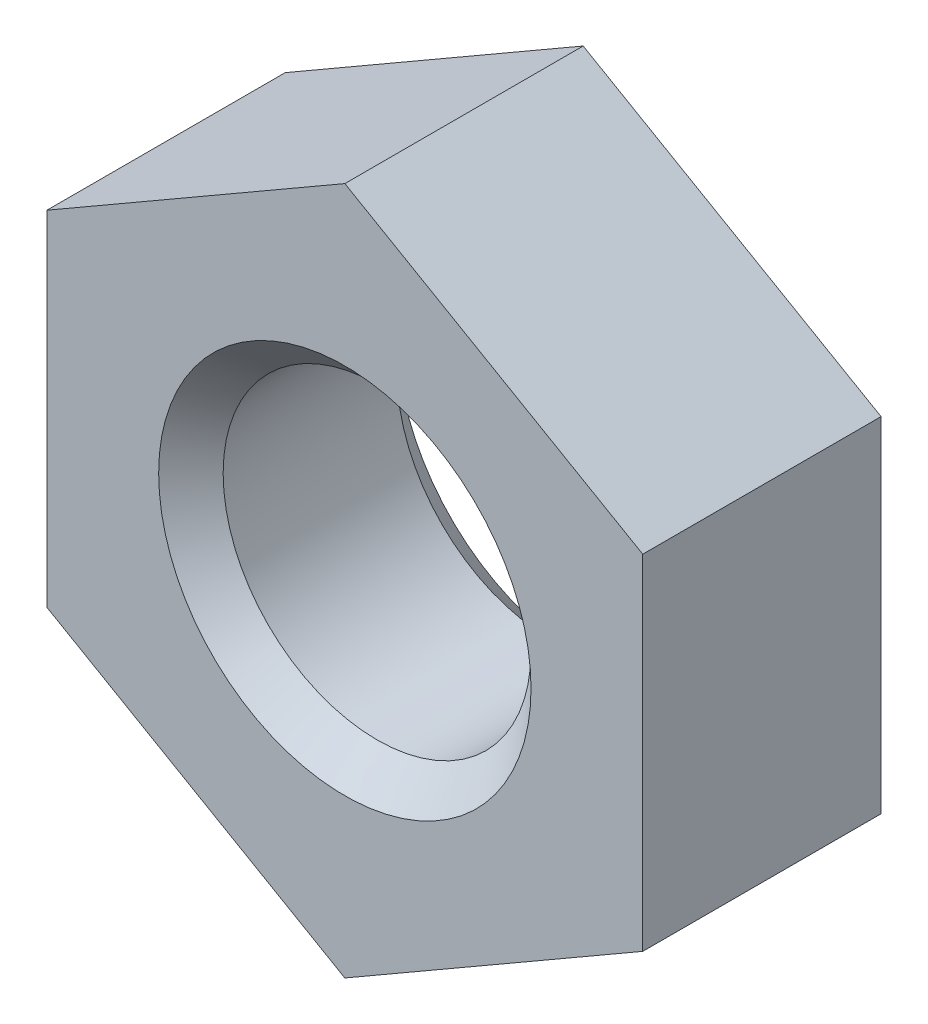
ISO-10303-21;
HEADER;
FILE_DESCRIPTION(('STEP AP214'),'2;1');
FILE_NAME('part.step','',(''),(''),'','','');
FILE_SCHEMA(('AUTOMOTIVE_DESIGN { 1 0 10303 214 1 1 1 1 }'));
ENDSEC;
DATA;
#1=APPLICATION_CONTEXT('core data for automotive mechanical design processes');
#2=APPLICATION_PROTOCOL_DEFINITION('international standard','automotive_design',2000,#1);
#3=PRODUCT_CONTEXT('',#1,'mechanical');
#4=PRODUCT('Part','Part','',(#3));
#5=PRODUCT_RELATED_PRODUCT_CATEGORY('part','',(#4));
#6=PRODUCT_DEFINITION_FORMATION('','',#4);
#7=PRODUCT_DEFINITION_CONTEXT('part definition',#1,'design');
#8=PRODUCT_DEFINITION('design','',#6,#7);
#9=PRODUCT_DEFINITION_SHAPE('','',#8);
#10=(LENGTH_UNIT() NAMED_UNIT(*) SI_UNIT(.MILLI.,.METRE.));
#11=(NAMED_UNIT(*) PLANE_ANGLE_UNIT() SI_UNIT($,.RADIAN.));
#12=(NAMED_UNIT(*) SI_UNIT($,.STERADIAN.) SOLID_ANGLE_UNIT());
#13=UNCERTAINTY_MEASURE_WITH_UNIT(LENGTH_MEASURE(1.E-05),#10,'distance_accuracy_value','');
#14=(GEOMETRIC_REPRESENTATION_CONTEXT(3) GLOBAL_UNCERTAINTY_ASSIGNED_CONTEXT((#13)) GLOBAL_UNIT_ASSIGNED_CONTEXT((#10,
#11,#12)) REPRESENTATION_CONTEXT('',''));
#15=CARTESIAN_POINT('',(0.,0.,0.));
#16=DIRECTION('',(0.,0.,1.));
#17=DIRECTION('',(1.,0.,0.));
#18=AXIS2_PLACEMENT_3D('',#15,#16,#17);
#19=CARTESIAN_POINT('',(-4.,-2.3094010767585,3.2));
#20=DIRECTION('',(-1.,0.,0.));
#21=DIRECTION('',(0.,1.,0.));
#22=AXIS2_PLACEMENT_3D('',#19,#20,#21);
#23=PLANE('',#22);
#24=DIRECTION('',(0.,-1.,0.));
#25=VECTOR('',#24,1.);
#26=CARTESIAN_POINT('',(-4.,2.3094010767585,0.));
#27=LINE('',#26,#25);
#28=CARTESIAN_POINT('',(-4.,2.3094010767585,0.));
#29=VERTEX_POINT('',#28);
#30=CARTESIAN_POINT('',(-4.,-2.3094010767585,0.));
#31=VERTEX_POINT('',#30);
#32=EDGE_CURVE('E72',#29,#31,#27,.T.);
#33=ORIENTED_EDGE('',*,*,#32,.T.);
#34=DIRECTION('',(0.,0.,1.));
#35=VECTOR('',#34,1.);
#36=CARTESIAN_POINT('',(-4.,-2.3094010767585,0.));
#37=LINE('',#36,#35);
#38=CARTESIAN_POINT('',(-4.,-2.3094010767585,3.2));
#39=VERTEX_POINT('',#38);
#40=EDGE_CURVE('E86',#39,#31,#37,.F.);
#41=ORIENTED_EDGE('',*,*,#40,.F.);
#42=DIRECTION('',(0.,1.,0.));
#43=VECTOR('',#42,1.);
#44=CARTESIAN_POINT('',(-4.,-2.3094010767585,3.2));
#45=LINE('',#44,#43);
#46=CARTESIAN_POINT('',(-4.,2.3094010767585,3.2));
#47=VERTEX_POINT('',#46);
#48=EDGE_CURVE('E92',#47,#39,#45,.F.);
#49=ORIENTED_EDGE('',*,*,#48,.F.);
#50=DIRECTION('',(0.,0.,-1.));
#51=VECTOR('',#50,1.);
#52=CARTESIAN_POINT('',(-4.,2.3094010767585,3.2));
#53=LINE('',#52,#51);
#54=EDGE_CURVE('E80',#47,#29,#53,.T.);
#55=ORIENTED_EDGE('',*,*,#54,.T.);
#56=EDGE_LOOP('',(#33,#41,#49,#55));
#57=FACE_BOUND('',#56,.T.);
#58=ADVANCED_FACE('F17',(#57),#23,.T.);
#59=CARTESIAN_POINT('',(0.,-4.618802153517,0.));
#60=DIRECTION('',(-0.5,-0.866025403784439,0.));
#61=DIRECTION('',(0.,0.,1.));
#62=AXIS2_PLACEMENT_3D('',#59,#60,#61);
#63=PLANE('',#62);
#64=DIRECTION('',(0.866025403784439,-0.5,0.));
#65=VECTOR('',#64,1.);
#66=CARTESIAN_POINT('',(-4.,-2.3094010767585,0.));
#67=LINE('',#66,#65);
#68=CARTESIAN_POINT('',(0.,-4.618802153517,0.));
#69=VERTEX_POINT('',#68);
#70=EDGE_CURVE('E68',#31,#69,#67,.T.);
#71=ORIENTED_EDGE('',*,*,#70,.T.);
#72=DIRECTION('',(0.,0.,1.));
#73=VECTOR('',#72,1.);
#74=CARTESIAN_POINT('',(0.,-4.618802153517,0.));
#75=LINE('',#74,#73);
#76=CARTESIAN_POINT('',(0.,-4.618802153517,3.2));
#77=VERTEX_POINT('',#76);
#78=EDGE_CURVE('E79',#77,#69,#75,.F.);
#79=ORIENTED_EDGE('',*,*,#78,.F.);
#80=DIRECTION('',(-0.866025403784439,0.5,0.));
#81=VECTOR('',#80,1.);
#82=CARTESIAN_POINT('',(0.,-4.618802153517,3.2));
#83=LINE('',#82,#81);
#84=EDGE_CURVE('E91',#39,#77,#83,.F.);
#85=ORIENTED_EDGE('',*,*,#84,.F.);
#86=ORIENTED_EDGE('',*,*,#40,.T.);
#87=EDGE_LOOP('',(#71,#79,#85,#86));
#88=FACE_BOUND('',#87,.T.);
#89=ADVANCED_FACE('F90',(#88),#63,.T.);
#90=CARTESIAN_POINT('',(4.,-2.3094010767585,0.));
#91=DIRECTION('',(0.5,-0.866025403784439,0.));
#92=DIRECTION('',(0.,0.,1.));
#93=AXIS2_PLACEMENT_3D('',#90,#91,#92);
#94=PLANE('',#93);
#95=DIRECTION('',(0.866025403784439,0.5,0.));
#96=VECTOR('',#95,1.);
#97=CARTESIAN_POINT('',(0.,-4.618802153517,0.));
#98=LINE('',#97,#96);
#99=CARTESIAN_POINT('',(4.,-2.3094010767585,0.));
#100=VERTEX_POINT('',#99);
#101=EDGE_CURVE('E74',#69,#100,#98,.T.);
#102=ORIENTED_EDGE('',*,*,#101,.T.);
#103=DIRECTION('',(0.,0.,1.));
#104=VECTOR('',#103,1.);
#105=CARTESIAN_POINT('',(4.,-2.3094010767585,0.));
#106=LINE('',#105,#104);
#107=CARTESIAN_POINT('',(4.,-2.3094010767585,3.2));
#108=VERTEX_POINT('',#107);
#109=EDGE_CURVE('E114',#108,#100,#106,.F.);
#110=ORIENTED_EDGE('',*,*,#109,.F.);
#111=DIRECTION('',(-0.866025403784439,-0.5,0.));
#112=VECTOR('',#111,1.);
#113=CARTESIAN_POINT('',(4.,-2.3094010767585,3.2));
#114=LINE('',#113,#112);
#115=EDGE_CURVE('E119',#77,#108,#114,.F.);
#116=ORIENTED_EDGE('',*,*,#115,.F.);
#117=ORIENTED_EDGE('',*,*,#78,.T.);
#118=EDGE_LOOP('',(#102,#110,#116,#117));
#119=FACE_BOUND('',#118,.T.);
#120=ADVANCED_FACE('F184',(#119),#94,.T.);
#121=CARTESIAN_POINT('',(4.,-2.3094010767585,0.));
#122=DIRECTION('',(1.,0.,0.));
#123=DIRECTION('',(0.,1.,0.));
#124=AXIS2_PLACEMENT_3D('',#121,#122,#123);
#125=PLANE('',#124);
#126=DIRECTION('',(0.,1.,0.));
#127=VECTOR('',#126,1.);
#128=CARTESIAN_POINT('',(4.,-2.3094010767585,0.));
#129=LINE('',#128,#127);
#130=CARTESIAN_POINT('',(4.,2.3094010767585,0.));
#131=VERTEX_POINT('',#130);
#132=EDGE_CURVE('E123',#100,#131,#129,.T.);
#133=ORIENTED_EDGE('',*,*,#132,.T.);
#134=DIRECTION('',(0.,0.,1.));
#135=VECTOR('',#134,1.);
#136=CARTESIAN_POINT('',(4.,2.3094010767585,0.));
#137=LINE('',#136,#135);
#138=CARTESIAN_POINT('',(4.,2.3094010767585,3.2));
#139=VERTEX_POINT('',#138);
#140=EDGE_CURVE('E128',#139,#131,#137,.F.);
#141=ORIENTED_EDGE('',*,*,#140,.F.);
#142=DIRECTION('',(0.,-1.,0.));
#143=VECTOR('',#142,1.);
#144=CARTESIAN_POINT('',(4.,2.3094010767585,3.2));
#145=LINE('',#144,#143);
#146=EDGE_CURVE('E133',#108,#139,#145,.F.);
#147=ORIENTED_EDGE('',*,*,#146,.F.);
#148=ORIENTED_EDGE('',*,*,#109,.T.);
#149=EDGE_LOOP('',(#133,#141,#147,#148));
#150=FACE_BOUND('',#149,.T.);
#151=ADVANCED_FACE('F189',(#150),#125,.T.);
#152=CARTESIAN_POINT('',(0.,4.618802153517,0.));
#153=DIRECTION('',(0.5,0.866025403784439,0.));
#154=DIRECTION('',(0.,0.,1.));
#155=AXIS2_PLACEMENT_3D('',#152,#153,#154);
#156=PLANE('',#155);
#157=DIRECTION('',(-0.866025403784439,0.5,0.));
#158=VECTOR('',#157,1.);
#159=CARTESIAN_POINT('',(4.,2.3094010767585,0.));
#160=LINE('',#159,#158);
#161=CARTESIAN_POINT('',(0.,4.618802153517,0.));
#162=VERTEX_POINT('',#161);
#163=EDGE_CURVE('E137',#131,#162,#160,.T.);
#164=ORIENTED_EDGE('',*,*,#163,.T.);
#165=DIRECTION('',(0.,0.,1.));
#166=VECTOR('',#165,1.);
#167=CARTESIAN_POINT('',(0.,4.618802153517,0.));
#168=LINE('',#167,#166);
#169=CARTESIAN_POINT('',(0.,4.618802153517,3.2));
#170=VERTEX_POINT('',#169);
#171=EDGE_CURVE('E141',#170,#162,#168,.F.);
#172=ORIENTED_EDGE('',*,*,#171,.F.);
#173=DIRECTION('',(0.866025403784439,-0.5,0.));
#174=VECTOR('',#173,1.);
#175=CARTESIAN_POINT('',(0.,4.618802153517,3.2));
#176=LINE('',#175,#174);
#177=EDGE_CURVE('E32',#139,#170,#176,.F.);
#178=ORIENTED_EDGE('',*,*,#177,.F.);
#179=ORIENTED_EDGE('',*,*,#140,.T.);
#180=EDGE_LOOP('',(#164,#172,#178,#179));
#181=FACE_BOUND('',#180,.T.);
#182=ADVANCED_FACE('F193',(#181),#156,.T.);
#183=CARTESIAN_POINT('',(-4.,2.3094010767585,0.));
#184=DIRECTION('',(-0.5,0.866025403784439,0.));
#185=DIRECTION('',(0.,0.,1.));
#186=AXIS2_PLACEMENT_3D('',#183,#184,#185);
#187=PLANE('',#186);
#188=DIRECTION('',(-0.866025403784439,-0.5,0.));
#189=VECTOR('',#188,1.);
#190=CARTESIAN_POINT('',(0.,4.618802153517,0.));
#191=LINE('',#190,#189);
#192=EDGE_CURVE('E40',#162,#29,#191,.T.);
#193=ORIENTED_EDGE('',*,*,#192,.T.);
#194=ORIENTED_EDGE('',*,*,#54,.F.);
#195=DIRECTION('',(0.866025403784439,0.5,0.));
#196=VECTOR('',#195,1.);
#197=CARTESIAN_POINT('',(-4.,2.3094010767585,3.2));
#198=LINE('',#197,#196);
#199=EDGE_CURVE('E152',#170,#47,#198,.F.);
#200=ORIENTED_EDGE('',*,*,#199,.F.);
#201=ORIENTED_EDGE('',*,*,#171,.T.);
#202=EDGE_LOOP('',(#193,#194,#200,#201));
#203=FACE_BOUND('',#202,.T.);
#204=ADVANCED_FACE('F197',(#203),#187,.T.);
#205=CARTESIAN_POINT('',(-4.,-4.618802153517,3.2));
#206=DIRECTION('',(0.,0.,1.));
#207=DIRECTION('',(1.,0.,0.));
#208=AXIS2_PLACEMENT_3D('',#205,#206,#207);
#209=PLANE('',#208);
#210=ORIENTED_EDGE('',*,*,#48,.T.);
#211=ORIENTED_EDGE('',*,*,#84,.T.);
#212=ORIENTED_EDGE('',*,*,#115,.T.);
#213=ORIENTED_EDGE('',*,*,#146,.T.);
#214=ORIENTED_EDGE('',*,*,#177,.T.);
#215=ORIENTED_EDGE('',*,*,#199,.T.);
#216=EDGE_LOOP('',(#210,#211,#212,#213,#214,#215));
#217=FACE_BOUND('',#216,.T.);
#218=CARTESIAN_POINT('',(0.,0.,3.2));
#219=DIRECTION('',(0.,0.,-1.));
#220=DIRECTION('',(0.99999999999999,-1.42053902152387E-07,0.));
#221=AXIS2_PLACEMENT_3D('',#218,#219,#220);
#222=CIRCLE('',#221,2.5);
#223=CARTESIAN_POINT('',(2.49999999999997,-3.55134755380967E-07,3.2));
#224=VERTEX_POINT('',#223);
#225=EDGE_CURVE('E156',#224,#224,#222,.T.);
#226=ORIENTED_EDGE('',*,*,#225,.T.);
#227=EDGE_LOOP('',(#226));
#228=FACE_BOUND('',#227,.T.);
#229=ADVANCED_FACE('F201',(#217,#228),#209,.T.);
#230=CARTESIAN_POINT('',(-4.,-4.618802153517,0.));
#231=DIRECTION('',(0.,0.,-1.));
#232=DIRECTION('',(0.,1.,0.));
#233=AXIS2_PLACEMENT_3D('',#230,#231,#232);
#234=PLANE('',#233);
#235=ORIENTED_EDGE('',*,*,#32,.F.);
#236=ORIENTED_EDGE('',*,*,#192,.F.);
#237=ORIENTED_EDGE('',*,*,#163,.F.);
#238=ORIENTED_EDGE('',*,*,#132,.F.);
#239=ORIENTED_EDGE('',*,*,#101,.F.);
#240=ORIENTED_EDGE('',*,*,#70,.F.);
#241=EDGE_LOOP('',(#235,#236,#237,#238,#239,#240));
#242=FACE_BOUND('',#241,.T.);
#243=CARTESIAN_POINT('',(0.,0.,0.));
#244=DIRECTION('',(0.,0.,1.));
#245=DIRECTION('',(-1.,0.,0.));
#246=AXIS2_PLACEMENT_3D('',#243,#244,#245);
#247=CIRCLE('',#246,2.5);
#248=CARTESIAN_POINT('',(-2.5,0.,0.));
#249=VERTEX_POINT('',#248);
#250=EDGE_CURVE('E161',#249,#249,#247,.F.);
#251=ORIENTED_EDGE('',*,*,#250,.F.);
#252=EDGE_LOOP('',(#251));
#253=FACE_BOUND('',#252,.T.);
#254=ADVANCED_FACE('F70',(#242,#253),#234,.T.);
#255=CARTESIAN_POINT('',(0.,0.,3.2));
#256=DIRECTION('',(0.,0.,1.));
#257=DIRECTION('',(-1.,0.,0.));
#258=AXIS2_PLACEMENT_3D('',#255,#256,#257);
#259=CONICAL_SURFACE('',#258,2.5,0.785398163397448);
#260=ORIENTED_EDGE('',*,*,#225,.F.);
#261=EDGE_LOOP('',(#260));
#262=FACE_BOUND('',#261,.T.);
#263=CARTESIAN_POINT('',(0.,0.,2.767));
#264=DIRECTION('',(0.,0.,-1.));
#265=DIRECTION('',(1.,0.,0.));
#266=AXIS2_PLACEMENT_3D('',#263,#264,#265);
#267=CIRCLE('',#266,2.067);
#268=CARTESIAN_POINT('',(2.067,0.,2.767));
#269=VERTEX_POINT('',#268);
#270=EDGE_CURVE('E25',#269,#269,#267,.T.);
#271=ORIENTED_EDGE('',*,*,#270,.T.);
#272=EDGE_LOOP('',(#271));
#273=FACE_BOUND('',#272,.T.);
#274=ADVANCED_FACE('F166',(#262,#273),#259,.F.);
#275=CARTESIAN_POINT('',(0.,0.,0.));
#276=DIRECTION('',(0.,0.,-1.));
#277=DIRECTION('',(1.,0.,0.));
#278=AXIS2_PLACEMENT_3D('',#275,#276,#277);
#279=CYLINDRICAL_SURFACE('',#278,2.067);
#280=CARTESIAN_POINT('',(0.,0.,0.433));
#281=DIRECTION('',(0.,0.,-1.));
#282=DIRECTION('',(1.,0.,0.));
#283=AXIS2_PLACEMENT_3D('',#280,#281,#282);
#284=CIRCLE('',#283,2.067);
#285=CARTESIAN_POINT('',(2.067,0.,0.433));
#286=VERTEX_POINT('',#285);
#287=EDGE_CURVE('E11',#286,#286,#284,.T.);
#288=ORIENTED_EDGE('',*,*,#287,.T.);
#289=EDGE_LOOP('',(#288));
#290=FACE_BOUND('',#289,.T.);
#291=ORIENTED_EDGE('',*,*,#270,.F.);
#292=EDGE_LOOP('',(#291));
#293=FACE_BOUND('',#292,.T.);
#294=ADVANCED_FACE('F168',(#290,#293),#279,.F.);
#295=CARTESIAN_POINT('',(0.,0.,0.));
#296=DIRECTION('',(0.,0.,-1.));
#297=DIRECTION('',(1.,0.,0.));
#298=AXIS2_PLACEMENT_3D('',#295,#296,#297);
#299=CONICAL_SURFACE('',#298,2.5,0.785398163397448);
#300=ORIENTED_EDGE('',*,*,#250,.T.);
#301=EDGE_LOOP('',(#300));
#302=FACE_BOUND('',#301,.T.);
#303=ORIENTED_EDGE('',*,*,#287,.F.);
#304=EDGE_LOOP('',(#303));
#305=FACE_BOUND('',#304,.T.);
#306=ADVANCED_FACE('F19',(#302,#305),#299,.F.);
#307=CLOSED_SHELL('',(#58,#89,#120,#151,#182,#204,#229,#254,#274,#294,#306));
#308=MANIFOLD_SOLID_BREP('B1',#307);
#309=ADVANCED_BREP_SHAPE_REPRESENTATION('',(#18,#308),#14);
#310=SHAPE_DEFINITION_REPRESENTATION(#9,#309);
ENDSEC;
END-ISO-10303-21;
